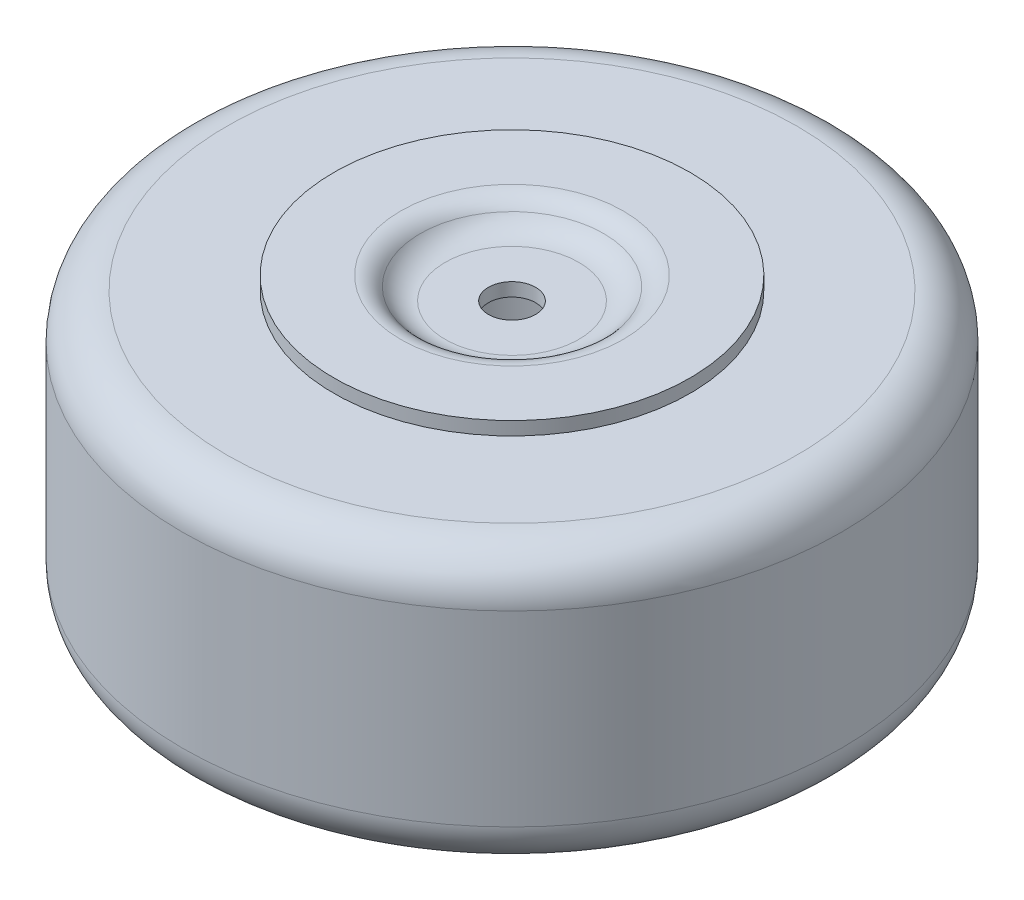
ISO-10303-21;
HEADER;
FILE_DESCRIPTION(('STEP AP214'),'2;1');
FILE_NAME('part.step','',(''),(''),'','','');
FILE_SCHEMA(('AUTOMOTIVE_DESIGN { 1 0 10303 214 1 1 1 1 }'));
ENDSEC;
DATA;
#1=APPLICATION_CONTEXT('core data for automotive mechanical design processes');
#2=APPLICATION_PROTOCOL_DEFINITION('international standard','automotive_design',2000,#1);
#3=PRODUCT_CONTEXT('',#1,'mechanical');
#4=PRODUCT('Part','Part','',(#3));
#5=PRODUCT_RELATED_PRODUCT_CATEGORY('part','',(#4));
#6=PRODUCT_DEFINITION_FORMATION('','',#4);
#7=PRODUCT_DEFINITION_CONTEXT('part definition',#1,'design');
#8=PRODUCT_DEFINITION('design','',#6,#7);
#9=PRODUCT_DEFINITION_SHAPE('','',#8);
#10=(LENGTH_UNIT() NAMED_UNIT(*) SI_UNIT(.MILLI.,.METRE.));
#11=(NAMED_UNIT(*) PLANE_ANGLE_UNIT() SI_UNIT($,.RADIAN.));
#12=(NAMED_UNIT(*) SI_UNIT($,.STERADIAN.) SOLID_ANGLE_UNIT());
#13=UNCERTAINTY_MEASURE_WITH_UNIT(LENGTH_MEASURE(1.E-05),#10,'distance_accuracy_value','');
#14=(GEOMETRIC_REPRESENTATION_CONTEXT(3) GLOBAL_UNCERTAINTY_ASSIGNED_CONTEXT((#13)) GLOBAL_UNIT_ASSIGNED_CONTEXT((#10,
#11,#12)) REPRESENTATION_CONTEXT('',''));
#15=CARTESIAN_POINT('',(0.,0.,0.));
#16=DIRECTION('',(0.,0.,1.));
#17=DIRECTION('',(1.,0.,0.));
#18=AXIS2_PLACEMENT_3D('',#15,#16,#17);
#19=CARTESIAN_POINT('',(0.,0.,0.));
#20=DIRECTION('',(0.,-1.,0.));
#21=DIRECTION('',(0.,0.,-1.));
#22=AXIS2_PLACEMENT_3D('',#19,#20,#21);
#23=CYLINDRICAL_SURFACE('',#22,20.);
#24=CARTESIAN_POINT('',(0.,31.,0.));
#25=DIRECTION('',(0.,-1.,0.));
#26=DIRECTION('',(0.,0.,-1.));
#27=AXIS2_PLACEMENT_3D('',#24,#25,#26);
#28=CIRCLE('',#27,20.);
#29=CARTESIAN_POINT('',(0.,31.,-20.));
#30=VERTEX_POINT('',#29);
#31=EDGE_CURVE('E73',#30,#30,#28,.T.);
#32=ORIENTED_EDGE('',*,*,#31,.F.);
#33=EDGE_LOOP('',(#32));
#34=FACE_BOUND('',#33,.T.);
#35=CARTESIAN_POINT('',(0.,32.5,0.));
#36=DIRECTION('',(0.,-1.,0.));
#37=DIRECTION('',(0.,0.,-1.));
#38=AXIS2_PLACEMENT_3D('',#35,#36,#37);
#39=CIRCLE('',#38,20.);
#40=CARTESIAN_POINT('',(0.,32.5,-20.));
#41=VERTEX_POINT('',#40);
#42=EDGE_CURVE('E11',#41,#41,#39,.T.);
#43=ORIENTED_EDGE('',*,*,#42,.T.);
#44=EDGE_LOOP('',(#43));
#45=FACE_BOUND('',#44,.T.);
#46=ADVANCED_FACE('F45',(#34,#45),#23,.T.);
#47=CARTESIAN_POINT('',(0.,32.5,20.));
#48=DIRECTION('',(0.,-1.,0.));
#49=DIRECTION('',(0.,0.,-1.));
#50=AXIS2_PLACEMENT_3D('',#47,#48,#49);
#51=PLANE('',#50);
#52=ORIENTED_EDGE('',*,*,#42,.F.);
#53=EDGE_LOOP('',(#52));
#54=FACE_BOUND('',#53,.T.);
#55=CARTESIAN_POINT('',(0.,32.5,0.));
#56=DIRECTION('',(0.,-1.,0.));
#57=DIRECTION('',(0.,0.,-1.));
#58=AXIS2_PLACEMENT_3D('',#55,#56,#57);
#59=CIRCLE('',#58,12.5);
#60=CARTESIAN_POINT('',(0.,32.5,-12.5));
#61=VERTEX_POINT('',#60);
#62=EDGE_CURVE('E51',#61,#61,#59,.T.);
#63=ORIENTED_EDGE('',*,*,#62,.T.);
#64=EDGE_LOOP('',(#63));
#65=FACE_BOUND('',#64,.T.);
#66=ADVANCED_FACE('F112',(#54,#65),#51,.F.);
#67=CARTESIAN_POINT('',(0.,29.75,0.));
#68=DIRECTION('',(0.,-1.,0.));
#69=DIRECTION('',(0.,0.,-1.));
#70=AXIS2_PLACEMENT_3D('',#67,#68,#69);
#71=TOROIDAL_SURFACE('',#70,12.5,2.75);
#72=ORIENTED_EDGE('',*,*,#62,.F.);
#73=EDGE_LOOP('',(#72));
#74=FACE_BOUND('',#73,.T.);
#75=CARTESIAN_POINT('',(0.,31.4,0.));
#76=DIRECTION('',(0.,-1.,0.));
#77=DIRECTION('',(0.,0.,-1.));
#78=AXIS2_PLACEMENT_3D('',#75,#76,#77);
#79=CIRCLE('',#78,10.3);
#80=CARTESIAN_POINT('',(0.,31.4,-10.3));
#81=VERTEX_POINT('',#80);
#82=EDGE_CURVE('E55',#81,#81,#79,.T.);
#83=ORIENTED_EDGE('',*,*,#82,.T.);
#84=EDGE_LOOP('',(#83));
#85=FACE_BOUND('',#84,.T.);
#86=ADVANCED_FACE('F116',(#74,#85),#71,.T.);
#87=CARTESIAN_POINT('',(0.,33.5,0.));
#88=DIRECTION('',(0.,-1.,0.));
#89=DIRECTION('',(0.,0.,-1.));
#90=AXIS2_PLACEMENT_3D('',#87,#88,#89);
#91=TOROIDAL_SURFACE('',#90,7.5,3.5);
#92=ORIENTED_EDGE('',*,*,#82,.F.);
#93=EDGE_LOOP('',(#92));
#94=FACE_BOUND('',#93,.T.);
#95=CARTESIAN_POINT('',(0.,30.,0.));
#96=DIRECTION('',(0.,-1.,0.));
#97=DIRECTION('',(0.,0.,-1.));
#98=AXIS2_PLACEMENT_3D('',#95,#96,#97);
#99=CIRCLE('',#98,7.5);
#100=CARTESIAN_POINT('',(0.,30.,-7.5));
#101=VERTEX_POINT('',#100);
#102=EDGE_CURVE('E59',#101,#101,#99,.T.);
#103=ORIENTED_EDGE('',*,*,#102,.T.);
#104=EDGE_LOOP('',(#103));
#105=FACE_BOUND('',#104,.T.);
#106=ADVANCED_FACE('F121',(#94,#105),#91,.F.);
#107=CARTESIAN_POINT('',(0.,30.,7.5));
#108=DIRECTION('',(0.,-1.,0.));
#109=DIRECTION('',(0.,0.,-1.));
#110=AXIS2_PLACEMENT_3D('',#107,#108,#109);
#111=PLANE('',#110);
#112=CARTESIAN_POINT('',(0.,30.,0.));
#113=DIRECTION('',(0.,-1.,0.));
#114=DIRECTION('',(0.,0.,-1.));
#115=AXIS2_PLACEMENT_3D('',#112,#113,#114);
#116=CIRCLE('',#115,2.65);
#117=CARTESIAN_POINT('',(0.,30.,-2.65));
#118=VERTEX_POINT('',#117);
#119=EDGE_CURVE('E76',#118,#118,#116,.T.);
#120=ORIENTED_EDGE('',*,*,#119,.T.);
#121=EDGE_LOOP('',(#120));
#122=FACE_BOUND('',#121,.T.);
#123=ORIENTED_EDGE('',*,*,#102,.F.);
#124=EDGE_LOOP('',(#123));
#125=FACE_BOUND('',#124,.T.);
#126=ADVANCED_FACE('F90',(#122,#125),#111,.F.);
#127=CARTESIAN_POINT('',(0.,28.5,7.5));
#128=DIRECTION('',(0.,1.,0.));
#129=DIRECTION('',(0.,0.,1.));
#130=AXIS2_PLACEMENT_3D('',#127,#128,#129);
#131=PLANE('',#130);
#132=CARTESIAN_POINT('',(0.,28.5,0.));
#133=DIRECTION('',(0.,-1.,0.));
#134=DIRECTION('',(0.,0.,-1.));
#135=AXIS2_PLACEMENT_3D('',#132,#133,#134);
#136=CIRCLE('',#135,2.65);
#137=CARTESIAN_POINT('',(0.,28.5,-2.65));
#138=VERTEX_POINT('',#137);
#139=EDGE_CURVE('E79',#138,#138,#136,.T.);
#140=ORIENTED_EDGE('',*,*,#139,.F.);
#141=EDGE_LOOP('',(#140));
#142=FACE_BOUND('',#141,.T.);
#143=CARTESIAN_POINT('',(0.,28.5,0.));
#144=DIRECTION('',(0.,-1.,0.));
#145=DIRECTION('',(0.,0.,-1.));
#146=AXIS2_PLACEMENT_3D('',#143,#144,#145);
#147=CIRCLE('',#146,7.5);
#148=CARTESIAN_POINT('',(0.,28.5,-7.5));
#149=VERTEX_POINT('',#148);
#150=EDGE_CURVE('E64',#149,#149,#147,.T.);
#151=ORIENTED_EDGE('',*,*,#150,.T.);
#152=EDGE_LOOP('',(#151));
#153=FACE_BOUND('',#152,.T.);
#154=ADVANCED_FACE('F86',(#142,#153),#131,.F.);
#155=CARTESIAN_POINT('',(0.,33.5,0.));
#156=DIRECTION('',(0.,-1.,0.));
#157=DIRECTION('',(0.,0.,-1.));
#158=AXIS2_PLACEMENT_3D('',#155,#156,#157);
#159=TOROIDAL_SURFACE('',#158,7.5,5.);
#160=ORIENTED_EDGE('',*,*,#150,.F.);
#161=EDGE_LOOP('',(#160));
#162=FACE_BOUND('',#161,.T.);
#163=CARTESIAN_POINT('',(0.,30.5,0.));
#164=DIRECTION('',(0.,-1.,0.));
#165=DIRECTION('',(0.,0.,-1.));
#166=AXIS2_PLACEMENT_3D('',#163,#164,#165);
#167=CIRCLE('',#166,11.5);
#168=CARTESIAN_POINT('',(0.,30.5,-11.5));
#169=VERTEX_POINT('',#168);
#170=EDGE_CURVE('E67',#169,#169,#167,.T.);
#171=ORIENTED_EDGE('',*,*,#170,.T.);
#172=EDGE_LOOP('',(#171));
#173=FACE_BOUND('',#172,.T.);
#174=ADVANCED_FACE('F89',(#162,#173),#159,.T.);
#175=CARTESIAN_POINT('',(0.,29.75,0.));
#176=DIRECTION('',(0.,-1.,0.));
#177=DIRECTION('',(0.,0.,-1.));
#178=AXIS2_PLACEMENT_3D('',#175,#176,#177);
#179=TOROIDAL_SURFACE('',#178,12.5,1.25);
#180=ORIENTED_EDGE('',*,*,#170,.F.);
#181=EDGE_LOOP('',(#180));
#182=FACE_BOUND('',#181,.T.);
#183=CARTESIAN_POINT('',(0.,31.,0.));
#184=DIRECTION('',(0.,-1.,0.));
#185=DIRECTION('',(0.,0.,-1.));
#186=AXIS2_PLACEMENT_3D('',#183,#184,#185);
#187=CIRCLE('',#186,12.5);
#188=CARTESIAN_POINT('',(0.,31.,-12.5));
#189=VERTEX_POINT('',#188);
#190=EDGE_CURVE('E70',#189,#189,#187,.T.);
#191=ORIENTED_EDGE('',*,*,#190,.T.);
#192=EDGE_LOOP('',(#191));
#193=FACE_BOUND('',#192,.T.);
#194=ADVANCED_FACE('F96',(#182,#193),#179,.F.);
#195=CARTESIAN_POINT('',(0.,31.,20.));
#196=DIRECTION('',(0.,1.,0.));
#197=DIRECTION('',(0.,0.,1.));
#198=AXIS2_PLACEMENT_3D('',#195,#196,#197);
#199=PLANE('',#198);
#200=ORIENTED_EDGE('',*,*,#190,.F.);
#201=EDGE_LOOP('',(#200));
#202=FACE_BOUND('',#201,.T.);
#203=ORIENTED_EDGE('',*,*,#31,.T.);
#204=EDGE_LOOP('',(#203));
#205=FACE_BOUND('',#204,.T.);
#206=ADVANCED_FACE('F102',(#202,#205),#199,.F.);
#207=CARTESIAN_POINT('',(0.,32.5,0.));
#208=DIRECTION('',(0.,-1.,0.));
#209=DIRECTION('',(0.,0.,-1.));
#210=AXIS2_PLACEMENT_3D('',#207,#208,#209);
#211=CYLINDRICAL_SURFACE('',#210,2.65);
#212=ORIENTED_EDGE('',*,*,#139,.T.);
#213=EDGE_LOOP('',(#212));
#214=FACE_BOUND('',#213,.T.);
#215=ORIENTED_EDGE('',*,*,#119,.F.);
#216=EDGE_LOOP('',(#215));
#217=FACE_BOUND('',#216,.T.);
#218=ADVANCED_FACE('F83',(#214,#217),#211,.F.);
#219=CLOSED_SHELL('',(#46,#66,#86,#106,#126,#154,#174,#194,#206,#218));
#220=MANIFOLD_SOLID_BREP('B2',#219);
#221=CARTESIAN_POINT('',(0.,20.5,9.5));
#222=DIRECTION('',(0.,-1.,0.));
#223=DIRECTION('',(0.,0.,-1.));
#224=AXIS2_PLACEMENT_3D('',#221,#222,#223);
#225=PLANE('',#224);
#226=CARTESIAN_POINT('',(0.,20.5,0.));
#227=DIRECTION('',(0.,-1.,0.));
#228=DIRECTION('',(0.,0.,-1.));
#229=AXIS2_PLACEMENT_3D('',#226,#227,#228);
#230=CIRCLE('',#229,9.5);
#231=CARTESIAN_POINT('',(0.,20.5,-9.5));
#232=VERTEX_POINT('',#231);
#233=EDGE_CURVE('E257',#232,#232,#230,.T.);
#234=ORIENTED_EDGE('',*,*,#233,.F.);
#235=EDGE_LOOP('',(#234));
#236=FACE_BOUND('',#235,.T.);
#237=CARTESIAN_POINT('',(0.,20.5,0.));
#238=DIRECTION('',(0.,-1.,0.));
#239=DIRECTION('',(0.,0.,-1.));
#240=AXIS2_PLACEMENT_3D('',#237,#238,#239);
#241=CIRCLE('',#240,2.65);
#242=CARTESIAN_POINT('',(0.,20.5,-2.65));
#243=VERTEX_POINT('',#242);
#244=EDGE_CURVE('E44',#243,#243,#241,.T.);
#245=ORIENTED_EDGE('',*,*,#244,.T.);
#246=EDGE_LOOP('',(#245));
#247=FACE_BOUND('',#246,.T.);
#248=ADVANCED_FACE('F217',(#236,#247),#225,.F.);
#249=CARTESIAN_POINT('',(0.,0.,0.));
#250=DIRECTION('',(0.,-1.,0.));
#251=DIRECTION('',(0.,0.,-1.));
#252=AXIS2_PLACEMENT_3D('',#249,#250,#251);
#253=CYLINDRICAL_SURFACE('',#252,2.65);
#254=ORIENTED_EDGE('',*,*,#244,.F.);
#255=EDGE_LOOP('',(#254));
#256=FACE_BOUND('',#255,.T.);
#257=CARTESIAN_POINT('',(0.,10.5,0.));
#258=DIRECTION('',(0.,-1.,0.));
#259=DIRECTION('',(0.,0.,-1.));
#260=AXIS2_PLACEMENT_3D('',#257,#258,#259);
#261=CIRCLE('',#260,2.65);
#262=CARTESIAN_POINT('',(0.,10.5,-2.65));
#263=VERTEX_POINT('',#262);
#264=EDGE_CURVE('E223',#263,#263,#261,.T.);
#265=ORIENTED_EDGE('',*,*,#264,.T.);
#266=EDGE_LOOP('',(#265));
#267=FACE_BOUND('',#266,.T.);
#268=ADVANCED_FACE('F264',(#256,#267),#253,.F.);
#269=CARTESIAN_POINT('',(0.,10.5,2.65));
#270=DIRECTION('',(0.,1.,0.));
#271=DIRECTION('',(0.,0.,1.));
#272=AXIS2_PLACEMENT_3D('',#269,#270,#271);
#273=PLANE('',#272);
#274=ORIENTED_EDGE('',*,*,#264,.F.);
#275=EDGE_LOOP('',(#274));
#276=FACE_BOUND('',#275,.T.);
#277=CARTESIAN_POINT('',(0.,10.5,0.));
#278=DIRECTION('',(0.,-1.,0.));
#279=DIRECTION('',(0.,0.,-1.));
#280=AXIS2_PLACEMENT_3D('',#277,#278,#279);
#281=CIRCLE('',#280,9.5);
#282=CARTESIAN_POINT('',(0.,10.5,-9.49999999999999));
#283=VERTEX_POINT('',#282);
#284=EDGE_CURVE('E227',#283,#283,#281,.T.);
#285=ORIENTED_EDGE('',*,*,#284,.T.);
#286=EDGE_LOOP('',(#285));
#287=FACE_BOUND('',#286,.T.);
#288=ADVANCED_FACE('F268',(#276,#287),#273,.F.);
#289=CARTESIAN_POINT('',(0.,0.,0.));
#290=DIRECTION('',(0.,-1.,0.));
#291=DIRECTION('',(0.,0.,-1.));
#292=AXIS2_PLACEMENT_3D('',#289,#290,#291);
#293=CYLINDRICAL_SURFACE('',#292,9.49999999999999);
#294=ORIENTED_EDGE('',*,*,#284,.F.);
#295=EDGE_LOOP('',(#294));
#296=FACE_BOUND('',#295,.T.);
#297=CARTESIAN_POINT('',(0.,5.00000000000004,0.));
#298=DIRECTION('',(0.,-1.,0.));
#299=DIRECTION('',(0.,0.,-1.));
#300=AXIS2_PLACEMENT_3D('',#297,#298,#299);
#301=CIRCLE('',#300,9.49999999999999);
#302=CARTESIAN_POINT('',(0.,5.00000000000004,-9.49999999999999));
#303=VERTEX_POINT('',#302);
#304=EDGE_CURVE('E231',#303,#303,#301,.T.);
#305=ORIENTED_EDGE('',*,*,#304,.T.);
#306=EDGE_LOOP('',(#305));
#307=FACE_BOUND('',#306,.T.);
#308=ADVANCED_FACE('F273',(#296,#307),#293,.F.);
#309=CARTESIAN_POINT('',(0.,5.,0.));
#310=DIRECTION('',(0.,-1.,0.));
#311=DIRECTION('',(0.,0.,-1.));
#312=AXIS2_PLACEMENT_3D('',#309,#310,#311);
#313=TOROIDAL_SURFACE('',#312,14.5,5.);
#314=ORIENTED_EDGE('',*,*,#304,.F.);
#315=EDGE_LOOP('',(#314));
#316=FACE_BOUND('',#315,.T.);
#317=CARTESIAN_POINT('',(0.,0.,0.));
#318=DIRECTION('',(0.,-1.,0.));
#319=DIRECTION('',(0.,0.,-1.));
#320=AXIS2_PLACEMENT_3D('',#317,#318,#319);
#321=CIRCLE('',#320,14.5);
#322=CARTESIAN_POINT('',(0.,0.,-14.5));
#323=VERTEX_POINT('',#322);
#324=EDGE_CURVE('E236',#323,#323,#321,.T.);
#325=ORIENTED_EDGE('',*,*,#324,.T.);
#326=EDGE_LOOP('',(#325));
#327=FACE_BOUND('',#326,.T.);
#328=ADVANCED_FACE('F279',(#316,#327),#313,.T.);
#329=CARTESIAN_POINT('',(0.,0.,14.5));
#330=DIRECTION('',(0.,1.,0.));
#331=DIRECTION('',(0.,0.,1.));
#332=AXIS2_PLACEMENT_3D('',#329,#330,#331);
#333=PLANE('',#332);
#334=ORIENTED_EDGE('',*,*,#324,.F.);
#335=EDGE_LOOP('',(#334));
#336=FACE_BOUND('',#335,.T.);
#337=CARTESIAN_POINT('',(0.,0.,0.));
#338=DIRECTION('',(0.,-1.,0.));
#339=DIRECTION('',(0.,0.,-1.));
#340=AXIS2_PLACEMENT_3D('',#337,#338,#339);
#341=CIRCLE('',#340,32.);
#342=CARTESIAN_POINT('',(0.,0.,-32.));
#343=VERTEX_POINT('',#342);
#344=EDGE_CURVE('E239',#343,#343,#341,.T.);
#345=ORIENTED_EDGE('',*,*,#344,.T.);
#346=EDGE_LOOP('',(#345));
#347=FACE_BOUND('',#346,.T.);
#348=ADVANCED_FACE('F283',(#336,#347),#333,.F.);
#349=CARTESIAN_POINT('',(0.,5.,0.));
#350=DIRECTION('',(0.,-1.,0.));
#351=DIRECTION('',(0.,0.,-1.));
#352=AXIS2_PLACEMENT_3D('',#349,#350,#351);
#353=TOROIDAL_SURFACE('',#352,32.,5.);
#354=ORIENTED_EDGE('',*,*,#344,.F.);
#355=EDGE_LOOP('',(#354));
#356=FACE_BOUND('',#355,.T.);
#357=CARTESIAN_POINT('',(0.,5.,0.));
#358=DIRECTION('',(0.,-1.,0.));
#359=DIRECTION('',(0.,0.,-1.));
#360=AXIS2_PLACEMENT_3D('',#357,#358,#359);
#361=CIRCLE('',#360,37.);
#362=CARTESIAN_POINT('',(0.,5.00000000000001,-37.));
#363=VERTEX_POINT('',#362);
#364=EDGE_CURVE('E242',#363,#363,#361,.T.);
#365=ORIENTED_EDGE('',*,*,#364,.T.);
#366=EDGE_LOOP('',(#365));
#367=FACE_BOUND('',#366,.T.);
#368=ADVANCED_FACE('F287',(#356,#367),#353,.T.);
#369=CARTESIAN_POINT('',(0.,0.,0.));
#370=DIRECTION('',(0.,-1.,0.));
#371=DIRECTION('',(0.,0.,-1.));
#372=AXIS2_PLACEMENT_3D('',#369,#370,#371);
#373=CYLINDRICAL_SURFACE('',#372,37.);
#374=ORIENTED_EDGE('',*,*,#364,.F.);
#375=EDGE_LOOP('',(#374));
#376=FACE_BOUND('',#375,.T.);
#377=CARTESIAN_POINT('',(0.,26.,0.));
#378=DIRECTION('',(0.,-1.,0.));
#379=DIRECTION('',(0.,0.,-1.));
#380=AXIS2_PLACEMENT_3D('',#377,#378,#379);
#381=CIRCLE('',#380,37.);
#382=CARTESIAN_POINT('',(0.,26.,-37.));
#383=VERTEX_POINT('',#382);
#384=EDGE_CURVE('E245',#383,#383,#381,.T.);
#385=ORIENTED_EDGE('',*,*,#384,.T.);
#386=EDGE_LOOP('',(#385));
#387=FACE_BOUND('',#386,.T.);
#388=ADVANCED_FACE('F291',(#376,#387),#373,.T.);
#389=CARTESIAN_POINT('',(0.,26.,0.));
#390=DIRECTION('',(0.,-1.,0.));
#391=DIRECTION('',(0.,0.,-1.));
#392=AXIS2_PLACEMENT_3D('',#389,#390,#391);
#393=TOROIDAL_SURFACE('',#392,32.,5.);
#394=ORIENTED_EDGE('',*,*,#384,.F.);
#395=EDGE_LOOP('',(#394));
#396=FACE_BOUND('',#395,.T.);
#397=CARTESIAN_POINT('',(0.,31.,0.));
#398=DIRECTION('',(0.,-1.,0.));
#399=DIRECTION('',(0.,0.,-1.));
#400=AXIS2_PLACEMENT_3D('',#397,#398,#399);
#401=CIRCLE('',#400,32.);
#402=CARTESIAN_POINT('',(0.,31.,-32.));
#403=VERTEX_POINT('',#402);
#404=EDGE_CURVE('E248',#403,#403,#401,.T.);
#405=ORIENTED_EDGE('',*,*,#404,.T.);
#406=EDGE_LOOP('',(#405));
#407=FACE_BOUND('',#406,.T.);
#408=ADVANCED_FACE('F295',(#396,#407),#393,.T.);
#409=CARTESIAN_POINT('',(0.,31.,32.));
#410=DIRECTION('',(0.,-1.,0.));
#411=DIRECTION('',(0.,0.,-1.));
#412=AXIS2_PLACEMENT_3D('',#409,#410,#411);
#413=PLANE('',#412);
#414=ORIENTED_EDGE('',*,*,#404,.F.);
#415=EDGE_LOOP('',(#414));
#416=FACE_BOUND('',#415,.T.);
#417=CARTESIAN_POINT('',(0.,31.,0.));
#418=DIRECTION('',(0.,-1.,0.));
#419=DIRECTION('',(0.,0.,-1.));
#420=AXIS2_PLACEMENT_3D('',#417,#418,#419);
#421=CIRCLE('',#420,14.5);
#422=CARTESIAN_POINT('',(0.,31.,-14.5));
#423=VERTEX_POINT('',#422);
#424=EDGE_CURVE('E251',#423,#423,#421,.T.);
#425=ORIENTED_EDGE('',*,*,#424,.T.);
#426=EDGE_LOOP('',(#425));
#427=FACE_BOUND('',#426,.T.);
#428=ADVANCED_FACE('F299',(#416,#427),#413,.F.);
#429=CARTESIAN_POINT('',(0.,26.,0.));
#430=DIRECTION('',(0.,-1.,0.));
#431=DIRECTION('',(0.,0.,-1.));
#432=AXIS2_PLACEMENT_3D('',#429,#430,#431);
#433=TOROIDAL_SURFACE('',#432,14.5,5.);
#434=ORIENTED_EDGE('',*,*,#424,.F.);
#435=EDGE_LOOP('',(#434));
#436=FACE_BOUND('',#435,.T.);
#437=CARTESIAN_POINT('',(0.,26.,0.));
#438=DIRECTION('',(0.,-1.,0.));
#439=DIRECTION('',(0.,0.,-1.));
#440=AXIS2_PLACEMENT_3D('',#437,#438,#439);
#441=CIRCLE('',#440,9.5);
#442=CARTESIAN_POINT('',(0.,26.,-9.49999999999999));
#443=VERTEX_POINT('',#442);
#444=EDGE_CURVE('E254',#443,#443,#441,.T.);
#445=ORIENTED_EDGE('',*,*,#444,.T.);
#446=EDGE_LOOP('',(#445));
#447=FACE_BOUND('',#446,.T.);
#448=ADVANCED_FACE('F303',(#436,#447),#433,.T.);
#449=CARTESIAN_POINT('',(0.,0.,0.));
#450=DIRECTION('',(0.,-1.,0.));
#451=DIRECTION('',(0.,0.,-1.));
#452=AXIS2_PLACEMENT_3D('',#449,#450,#451);
#453=CYLINDRICAL_SURFACE('',#452,9.5);
#454=ORIENTED_EDGE('',*,*,#444,.F.);
#455=EDGE_LOOP('',(#454));
#456=FACE_BOUND('',#455,.T.);
#457=ORIENTED_EDGE('',*,*,#233,.T.);
#458=EDGE_LOOP('',(#457));
#459=FACE_BOUND('',#458,.T.);
#460=ADVANCED_FACE('F261',(#456,#459),#453,.F.);
#461=CLOSED_SHELL('',(#248,#268,#288,#308,#328,#348,#368,#388,#408,#428,#448,#460));
#462=MANIFOLD_SOLID_BREP('B6',#461);
#463=ADVANCED_BREP_SHAPE_REPRESENTATION('',(#18,#220,#462),#14);
#464=SHAPE_DEFINITION_REPRESENTATION(#9,#463);
ENDSEC;
END-ISO-10303-21;
